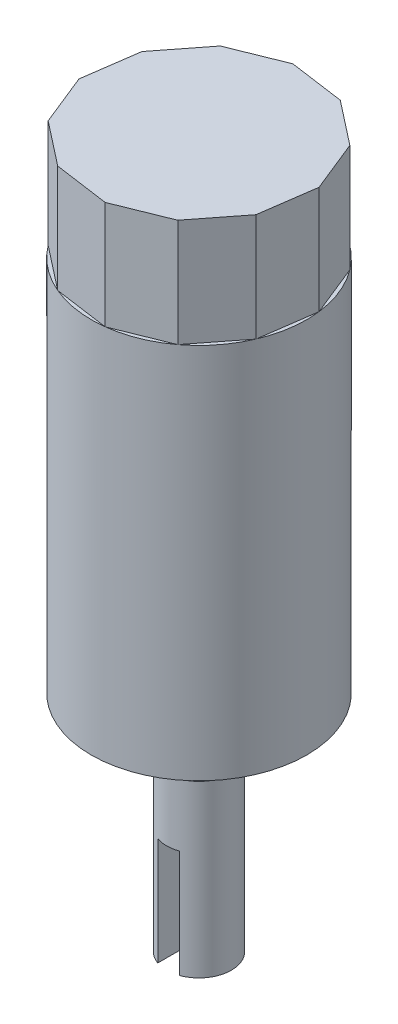
ISO-10303-21;
HEADER;
FILE_DESCRIPTION(('STEP AP214'),'2;1');
FILE_NAME('part.step','',(''),(''),'','','');
FILE_SCHEMA(('AUTOMOTIVE_DESIGN { 1 0 10303 214 1 1 1 1 }'));
ENDSEC;
DATA;
#1=APPLICATION_CONTEXT('core data for automotive mechanical design processes');
#2=APPLICATION_PROTOCOL_DEFINITION('international standard','automotive_design',2000,#1);
#3=PRODUCT_CONTEXT('',#1,'mechanical');
#4=PRODUCT('Part','Part','',(#3));
#5=PRODUCT_RELATED_PRODUCT_CATEGORY('part','',(#4));
#6=PRODUCT_DEFINITION_FORMATION('','',#4);
#7=PRODUCT_DEFINITION_CONTEXT('part definition',#1,'design');
#8=PRODUCT_DEFINITION('design','',#6,#7);
#9=PRODUCT_DEFINITION_SHAPE('','',#8);
#10=(LENGTH_UNIT() NAMED_UNIT(*) SI_UNIT(.MILLI.,.METRE.));
#11=(NAMED_UNIT(*) PLANE_ANGLE_UNIT() SI_UNIT($,.RADIAN.));
#12=(NAMED_UNIT(*) SI_UNIT($,.STERADIAN.) SOLID_ANGLE_UNIT());
#13=UNCERTAINTY_MEASURE_WITH_UNIT(LENGTH_MEASURE(1.E-05),#10,'distance_accuracy_value','');
#14=(GEOMETRIC_REPRESENTATION_CONTEXT(3) GLOBAL_UNCERTAINTY_ASSIGNED_CONTEXT((#13)) GLOBAL_UNIT_ASSIGNED_CONTEXT((#10,
#11,#12)) REPRESENTATION_CONTEXT('',''));
#15=CARTESIAN_POINT('',(0.,0.,0.));
#16=DIRECTION('',(0.,0.,1.));
#17=DIRECTION('',(1.,0.,0.));
#18=AXIS2_PLACEMENT_3D('',#15,#16,#17);
#19=CARTESIAN_POINT('',(0.,32.9,0.));
#20=DIRECTION('',(0.,-1.,0.));
#21=DIRECTION('',(0.,0.,-1.));
#22=AXIS2_PLACEMENT_3D('',#19,#20,#21);
#23=CYLINDRICAL_SURFACE('',#22,5.);
#24=CARTESIAN_POINT('',(0.,10.4,0.));
#25=DIRECTION('',(0.,1.,0.));
#26=DIRECTION('',(0.,0.,1.));
#27=AXIS2_PLACEMENT_3D('',#24,#25,#26);
#28=CIRCLE('',#27,5.);
#29=CARTESIAN_POINT('',(0.,10.4,5.));
#30=VERTEX_POINT('',#29);
#31=EDGE_CURVE('E257',#30,#30,#28,.T.);
#32=ORIENTED_EDGE('',*,*,#31,.T.);
#33=EDGE_LOOP('',(#32));
#34=FACE_BOUND('',#33,.T.);
#35=CARTESIAN_POINT('',(0.,27.9,0.));
#36=DIRECTION('',(0.,1.,0.));
#37=DIRECTION('',(0.,0.,1.));
#38=AXIS2_PLACEMENT_3D('',#35,#36,#37);
#39=CIRCLE('',#38,5.);
#40=CARTESIAN_POINT('',(3.99404714228788,27.9,-3.00792078106821));
#41=VERTEX_POINT('',#40);
#42=CARTESIAN_POINT('',(1.95498589859983,27.9,-4.60195938012015));
#43=VERTEX_POINT('',#42);
#44=EDGE_CURVE('E195',#41,#43,#39,.T.);
#45=ORIENTED_EDGE('',*,*,#44,.F.);
#46=CARTESIAN_POINT('',(0.,27.9,0.));
#47=DIRECTION('',(0.,1.,0.));
#48=DIRECTION('',(0.,0.,1.));
#49=AXIS2_PLACEMENT_3D('',#46,#47,#48);
#50=CIRCLE('',#49,5.);
#51=CARTESIAN_POINT('',(4.96290667966805,27.9,-0.60791223783227));
#52=VERTEX_POINT('',#51);
#53=EDGE_CURVE('E190',#52,#41,#50,.T.);
#54=ORIENTED_EDGE('',*,*,#53,.F.);
#55=CARTESIAN_POINT('',(0.,27.9,0.));
#56=DIRECTION('',(0.,1.,0.));
#57=DIRECTION('',(0.,0.,1.));
#58=AXIS2_PLACEMENT_3D('',#55,#56,#57);
#59=CIRCLE('',#58,5.);
#60=CARTESIAN_POINT('',(4.60195938012015,27.9,1.95498589859984));
#61=VERTEX_POINT('',#60);
#62=EDGE_CURVE('E668',#61,#52,#59,.T.);
#63=ORIENTED_EDGE('',*,*,#62,.F.);
#64=CARTESIAN_POINT('',(0.,27.9,0.));
#65=DIRECTION('',(0.,1.,0.));
#66=DIRECTION('',(0.,0.,1.));
#67=AXIS2_PLACEMENT_3D('',#64,#65,#66);
#68=CIRCLE('',#67,5.);
#69=CARTESIAN_POINT('',(3.00792078106821,27.9,3.99404714228788));
#70=VERTEX_POINT('',#69);
#71=EDGE_CURVE('E722',#70,#61,#68,.T.);
#72=ORIENTED_EDGE('',*,*,#71,.F.);
#73=CARTESIAN_POINT('',(0.,27.9,0.));
#74=DIRECTION('',(0.,1.,0.));
#75=DIRECTION('',(0.,0.,1.));
#76=AXIS2_PLACEMENT_3D('',#73,#74,#75);
#77=CIRCLE('',#76,5.);
#78=CARTESIAN_POINT('',(0.60791223783227,27.9,4.96290667966805));
#79=VERTEX_POINT('',#78);
#80=EDGE_CURVE('E680',#79,#70,#77,.T.);
#81=ORIENTED_EDGE('',*,*,#80,.F.);
#82=CARTESIAN_POINT('',(0.,27.9,0.));
#83=DIRECTION('',(0.,1.,0.));
#84=DIRECTION('',(0.,0.,1.));
#85=AXIS2_PLACEMENT_3D('',#82,#83,#84);
#86=CIRCLE('',#85,5.);
#87=CARTESIAN_POINT('',(-1.95498589859982,27.9,4.60195938012015));
#88=VERTEX_POINT('',#87);
#89=EDGE_CURVE('E703',#88,#79,#86,.T.);
#90=ORIENTED_EDGE('',*,*,#89,.F.);
#91=CARTESIAN_POINT('',(0.,27.9,0.));
#92=DIRECTION('',(0.,1.,0.));
#93=DIRECTION('',(0.,0.,1.));
#94=AXIS2_PLACEMENT_3D('',#91,#92,#93);
#95=CIRCLE('',#94,5.);
#96=CARTESIAN_POINT('',(-3.99404714228787,27.9,3.00792078106823));
#97=VERTEX_POINT('',#96);
#98=EDGE_CURVE('E654',#97,#88,#95,.T.);
#99=ORIENTED_EDGE('',*,*,#98,.F.);
#100=CARTESIAN_POINT('',(0.,27.9,0.));
#101=DIRECTION('',(0.,1.,0.));
#102=DIRECTION('',(0.,0.,1.));
#103=AXIS2_PLACEMENT_3D('',#100,#101,#102);
#104=CIRCLE('',#103,5.);
#105=CARTESIAN_POINT('',(-4.96290667966805,27.9,0.60791223783227));
#106=VERTEX_POINT('',#105);
#107=EDGE_CURVE('E231',#106,#97,#104,.T.);
#108=ORIENTED_EDGE('',*,*,#107,.F.);
#109=CARTESIAN_POINT('',(0.,27.9,0.));
#110=DIRECTION('',(0.,1.,0.));
#111=DIRECTION('',(0.,0.,1.));
#112=AXIS2_PLACEMENT_3D('',#109,#110,#111);
#113=CIRCLE('',#112,5.);
#114=CARTESIAN_POINT('',(-4.60195938012015,27.9,-1.95498589859984));
#115=VERTEX_POINT('',#114);
#116=EDGE_CURVE('E642',#115,#106,#113,.T.);
#117=ORIENTED_EDGE('',*,*,#116,.F.);
#118=CARTESIAN_POINT('',(0.,27.9,0.));
#119=DIRECTION('',(0.,1.,0.));
#120=DIRECTION('',(0.,0.,1.));
#121=AXIS2_PLACEMENT_3D('',#118,#119,#120);
#122=CIRCLE('',#121,5.);
#123=CARTESIAN_POINT('',(-3.00792078106821,27.9,-3.99404714228788));
#124=VERTEX_POINT('',#123);
#125=EDGE_CURVE('E623',#124,#115,#122,.T.);
#126=ORIENTED_EDGE('',*,*,#125,.F.);
#127=CARTESIAN_POINT('',(0.,27.9,0.));
#128=DIRECTION('',(0.,1.,0.));
#129=DIRECTION('',(0.,0.,1.));
#130=AXIS2_PLACEMENT_3D('',#127,#128,#129);
#131=CIRCLE('',#130,5.);
#132=CARTESIAN_POINT('',(-0.607912237832263,27.9,-4.96290667966805));
#133=VERTEX_POINT('',#132);
#134=EDGE_CURVE('E616',#133,#124,#131,.T.);
#135=ORIENTED_EDGE('',*,*,#134,.F.);
#136=CARTESIAN_POINT('',(0.,27.9,0.));
#137=DIRECTION('',(0.,1.,0.));
#138=DIRECTION('',(0.,0.,1.));
#139=AXIS2_PLACEMENT_3D('',#136,#137,#138);
#140=CIRCLE('',#139,5.);
#141=EDGE_CURVE('E206',#43,#133,#140,.T.);
#142=ORIENTED_EDGE('',*,*,#141,.F.);
#143=EDGE_LOOP('',(#45,#54,#63,#72,#81,#90,#99,#108,#117,#126,#135,#142));
#144=FACE_BOUND('',#143,.T.);
#145=ADVANCED_FACE('F62',(#34,#144),#23,.T.);
#146=CARTESIAN_POINT('',(0.,32.9,0.));
#147=DIRECTION('',(0.,1.,0.));
#148=DIRECTION('',(0.,0.,1.));
#149=AXIS2_PLACEMENT_3D('',#146,#147,#148);
#150=PLANE('',#149);
#151=DIRECTION('',(-0.374338579680795,0.,-0.927292094090403));
#152=VECTOR('',#151,1.);
#153=CARTESIAN_POINT('',(4.47847691097797,32.9,-1.80791650945024));
#154=LINE('',#153,#152);
#155=CARTESIAN_POINT('',(4.96290667966805,32.9,-0.60791223783227));
#156=VERTEX_POINT('',#155);
#157=CARTESIAN_POINT('',(3.99404714228788,32.9,-3.00792078106822));
#158=VERTEX_POINT('',#157);
#159=EDGE_CURVE('E217',#156,#158,#154,.T.);
#160=ORIENTED_EDGE('',*,*,#159,.T.);
#161=DIRECTION('',(-0.787832766665356,0.,-0.615889220370362));
#162=VECTOR('',#161,1.);
#163=CARTESIAN_POINT('',(2.97451652044386,32.9,-3.80494008059418));
#164=LINE('',#163,#162);
#165=CARTESIAN_POINT('',(1.95498589859983,32.9,-4.60195938012015));
#166=VERTEX_POINT('',#165);
#167=EDGE_CURVE('E183',#158,#166,#164,.T.);
#168=ORIENTED_EDGE('',*,*,#167,.T.);
#169=DIRECTION('',(-0.990227800051157,0.,-0.139459327425048));
#170=VECTOR('',#169,1.);
#171=CARTESIAN_POINT('',(0.673536830383785,32.9,-4.7824330298941));
#172=LINE('',#171,#170);
#173=CARTESIAN_POINT('',(-0.607912237832263,32.9,-4.96290667966805));
#174=VERTEX_POINT('',#173);
#175=EDGE_CURVE('E246',#166,#174,#172,.T.);
#176=ORIENTED_EDGE('',*,*,#175,.T.);
#177=DIRECTION('',(-0.927292094090403,0.,0.374338579680795));
#178=VECTOR('',#177,1.);
#179=CARTESIAN_POINT('',(-1.80791650945025,32.9,-4.47847691097797));
#180=LINE('',#179,#178);
#181=CARTESIAN_POINT('',(-3.00792078106821,32.9,-3.99404714228788));
#182=VERTEX_POINT('',#181);
#183=EDGE_CURVE('E208',#174,#182,#180,.T.);
#184=ORIENTED_EDGE('',*,*,#183,.T.);
#185=DIRECTION('',(-0.615889220370361,0.,0.787832766665356));
#186=VECTOR('',#185,1.);
#187=CARTESIAN_POINT('',(-3.80494008059418,32.9,-2.97451652044385));
#188=LINE('',#187,#186);
#189=CARTESIAN_POINT('',(-4.60195938012014,32.9,-1.95498589859984));
#190=VERTEX_POINT('',#189);
#191=EDGE_CURVE('E256',#182,#190,#188,.T.);
#192=ORIENTED_EDGE('',*,*,#191,.T.);
#193=DIRECTION('',(-0.139459327425048,0.,0.990227800051157));
#194=VECTOR('',#193,1.);
#195=CARTESIAN_POINT('',(-4.7824330298941,32.9,-0.673536830383785));
#196=LINE('',#195,#194);
#197=CARTESIAN_POINT('',(-4.96290667966805,32.9,0.60791223783227));
#198=VERTEX_POINT('',#197);
#199=EDGE_CURVE('E88',#190,#198,#196,.T.);
#200=ORIENTED_EDGE('',*,*,#199,.T.);
#201=DIRECTION('',(0.374338579680796,0.,0.927292094090403));
#202=VECTOR('',#201,1.);
#203=CARTESIAN_POINT('',(-4.47847691097796,32.9,1.80791650945025));
#204=LINE('',#203,#202);
#205=CARTESIAN_POINT('',(-3.99404714228787,32.9,3.00792078106823));
#206=VERTEX_POINT('',#205);
#207=EDGE_CURVE('E232',#198,#206,#204,.T.);
#208=ORIENTED_EDGE('',*,*,#207,.T.);
#209=DIRECTION('',(0.787832766665357,0.,0.61588922037036));
#210=VECTOR('',#209,1.);
#211=CARTESIAN_POINT('',(-2.97451652044385,32.9,3.80494008059419));
#212=LINE('',#211,#210);
#213=CARTESIAN_POINT('',(-1.95498589859982,32.9,4.60195938012015));
#214=VERTEX_POINT('',#213);
#215=EDGE_CURVE('E80',#206,#214,#212,.T.);
#216=ORIENTED_EDGE('',*,*,#215,.T.);
#217=DIRECTION('',(0.990227800051157,0.,0.139459327425044));
#218=VECTOR('',#217,1.);
#219=CARTESIAN_POINT('',(-0.673536830383771,32.9,4.7824330298941));
#220=LINE('',#219,#218);
#221=CARTESIAN_POINT('',(0.60791223783227,32.9,4.96290667966805));
#222=VERTEX_POINT('',#221);
#223=EDGE_CURVE('E704',#214,#222,#220,.T.);
#224=ORIENTED_EDGE('',*,*,#223,.T.);
#225=DIRECTION('',(0.927292094090403,0.,-0.374338579680795));
#226=VECTOR('',#225,1.);
#227=CARTESIAN_POINT('',(1.80791650945024,32.9,4.47847691097797));
#228=LINE('',#227,#226);
#229=CARTESIAN_POINT('',(3.00792078106821,32.9,3.99404714228788));
#230=VERTEX_POINT('',#229);
#231=EDGE_CURVE('E675',#222,#230,#228,.T.);
#232=ORIENTED_EDGE('',*,*,#231,.T.);
#233=DIRECTION('',(0.615889220370362,0.,-0.787832766665355));
#234=VECTOR('',#233,1.);
#235=CARTESIAN_POINT('',(3.80494008059418,32.9,2.97451652044386));
#236=LINE('',#235,#234);
#237=CARTESIAN_POINT('',(4.60195938012015,32.9,1.95498589859984));
#238=VERTEX_POINT('',#237);
#239=EDGE_CURVE('E189',#230,#238,#236,.T.);
#240=ORIENTED_EDGE('',*,*,#239,.T.);
#241=DIRECTION('',(0.139459327425048,0.,-0.990227800051157));
#242=VECTOR('',#241,1.);
#243=CARTESIAN_POINT('',(4.7824330298941,32.9,0.673536830383785));
#244=LINE('',#243,#242);
#245=EDGE_CURVE('E663',#238,#156,#244,.T.);
#246=ORIENTED_EDGE('',*,*,#245,.T.);
#247=EDGE_LOOP('',(#160,#168,#176,#184,#192,#200,#208,#216,#224,#232,#240,#246));
#248=FACE_BOUND('',#247,.T.);
#249=ADVANCED_FACE('F341',(#248),#150,.T.);
#250=CARTESIAN_POINT('',(0.,0.,0.));
#251=DIRECTION('',(0.,1.,0.));
#252=DIRECTION('',(0.,0.,1.));
#253=AXIS2_PLACEMENT_3D('',#250,#251,#252);
#254=PLANE('',#253);
#255=CARTESIAN_POINT('',(0.,0.,0.));
#256=DIRECTION('',(0.,1.,0.));
#257=DIRECTION('',(0.,0.,1.));
#258=AXIS2_PLACEMENT_3D('',#255,#256,#257);
#259=CIRCLE('',#258,1.5);
#260=CARTESIAN_POINT('',(0.5,0.,1.4142135623731));
#261=VERTEX_POINT('',#260);
#262=CARTESIAN_POINT('',(0.5,0.,-1.4142135623731));
#263=VERTEX_POINT('',#262);
#264=EDGE_CURVE('E66',#261,#263,#259,.T.);
#265=ORIENTED_EDGE('',*,*,#264,.F.);
#266=DIRECTION('',(0.,0.,1.));
#267=VECTOR('',#266,1.);
#268=CARTESIAN_POINT('',(0.5,0.,-1.4142135623731));
#269=LINE('',#268,#267);
#270=EDGE_CURVE('E272',#263,#261,#269,.T.);
#271=ORIENTED_EDGE('',*,*,#270,.F.);
#272=EDGE_LOOP('',(#265,#271));
#273=FACE_BOUND('',#272,.T.);
#274=ADVANCED_FACE('F328',(#273),#254,.F.);
#275=CARTESIAN_POINT('',(0.,7.9,0.));
#276=DIRECTION('',(0.,-1.,0.));
#277=DIRECTION('',(0.,0.,-1.));
#278=AXIS2_PLACEMENT_3D('',#275,#276,#277);
#279=CYLINDRICAL_SURFACE('',#278,1.5);
#280=ORIENTED_EDGE('',*,*,#264,.T.);
#281=DIRECTION('',(0.,-1.,0.));
#282=VECTOR('',#281,1.);
#283=CARTESIAN_POINT('',(0.5,5.,-1.4142135623731));
#284=LINE('',#283,#282);
#285=CARTESIAN_POINT('',(0.5,5.,-1.4142135623731));
#286=VERTEX_POINT('',#285);
#287=EDGE_CURVE('E293',#286,#263,#284,.T.);
#288=ORIENTED_EDGE('',*,*,#287,.F.);
#289=CARTESIAN_POINT('',(0.,5.,0.));
#290=DIRECTION('',(0.,-1.,0.));
#291=DIRECTION('',(0.,0.,-1.));
#292=AXIS2_PLACEMENT_3D('',#289,#290,#291);
#293=CIRCLE('',#292,1.5);
#294=CARTESIAN_POINT('',(-0.5,5.,-1.4142135623731));
#295=VERTEX_POINT('',#294);
#296=EDGE_CURVE('E276',#295,#286,#293,.T.);
#297=ORIENTED_EDGE('',*,*,#296,.F.);
#298=DIRECTION('',(0.,-1.,0.));
#299=VECTOR('',#298,1.);
#300=CARTESIAN_POINT('',(-0.5,5.,-1.4142135623731));
#301=LINE('',#300,#299);
#302=CARTESIAN_POINT('',(-0.5,0.,-1.4142135623731));
#303=VERTEX_POINT('',#302);
#304=EDGE_CURVE('E296',#295,#303,#301,.T.);
#305=ORIENTED_EDGE('',*,*,#304,.T.);
#306=CARTESIAN_POINT('',(-0.5,0.,1.4142135623731));
#307=VERTEX_POINT('',#306);
#308=EDGE_CURVE('E292',#303,#307,#259,.T.);
#309=ORIENTED_EDGE('',*,*,#308,.T.);
#310=DIRECTION('',(0.,-1.,0.));
#311=VECTOR('',#310,1.);
#312=CARTESIAN_POINT('',(-0.5,5.,1.4142135623731));
#313=LINE('',#312,#311);
#314=CARTESIAN_POINT('',(-0.5,5.,1.4142135623731));
#315=VERTEX_POINT('',#314);
#316=EDGE_CURVE('E283',#315,#307,#313,.T.);
#317=ORIENTED_EDGE('',*,*,#316,.F.);
#318=CARTESIAN_POINT('',(0.,5.,0.));
#319=DIRECTION('',(0.,-1.,0.));
#320=DIRECTION('',(0.,0.,1.));
#321=AXIS2_PLACEMENT_3D('',#318,#319,#320);
#322=CIRCLE('',#321,1.50000000000001);
#323=CARTESIAN_POINT('',(0.5,5.,1.4142135623731));
#324=VERTEX_POINT('',#323);
#325=EDGE_CURVE('E267',#324,#315,#322,.T.);
#326=ORIENTED_EDGE('',*,*,#325,.F.);
#327=DIRECTION('',(0.,-1.,0.));
#328=VECTOR('',#327,1.);
#329=CARTESIAN_POINT('',(0.5,5.,1.4142135623731));
#330=LINE('',#329,#328);
#331=EDGE_CURVE('E288',#324,#261,#330,.T.);
#332=ORIENTED_EDGE('',*,*,#331,.T.);
#333=EDGE_LOOP('',(#280,#288,#297,#305,#309,#317,#326,#332));
#334=FACE_BOUND('',#333,.T.);
#335=CARTESIAN_POINT('',(0.,7.9,0.));
#336=DIRECTION('',(0.,1.,0.));
#337=DIRECTION('',(0.,0.,1.));
#338=AXIS2_PLACEMENT_3D('',#335,#336,#337);
#339=CIRCLE('',#338,1.5);
#340=CARTESIAN_POINT('',(0.,7.9,1.5));
#341=VERTEX_POINT('',#340);
#342=EDGE_CURVE('E72',#341,#341,#339,.T.);
#343=ORIENTED_EDGE('',*,*,#342,.F.);
#344=EDGE_LOOP('',(#343));
#345=FACE_BOUND('',#344,.T.);
#346=ADVANCED_FACE('F64',(#334,#345),#279,.T.);
#347=CARTESIAN_POINT('',(0.,7.9,0.));
#348=DIRECTION('',(0.,1.,0.));
#349=DIRECTION('',(0.,0.,1.));
#350=AXIS2_PLACEMENT_3D('',#347,#348,#349);
#351=PLANE('',#350);
#352=CARTESIAN_POINT('',(0.,7.9,0.));
#353=DIRECTION('',(0.,1.,0.));
#354=DIRECTION('',(0.,0.,1.));
#355=AXIS2_PLACEMENT_3D('',#352,#353,#354);
#356=CIRCLE('',#355,1.);
#357=CARTESIAN_POINT('',(0.,7.9,1.));
#358=VERTEX_POINT('',#357);
#359=EDGE_CURVE('E12',#358,#358,#356,.T.);
#360=ORIENTED_EDGE('',*,*,#359,.F.);
#361=EDGE_LOOP('',(#360));
#362=FACE_BOUND('',#361,.T.);
#363=ORIENTED_EDGE('',*,*,#342,.T.);
#364=EDGE_LOOP('',(#363));
#365=FACE_BOUND('',#364,.T.);
#366=ADVANCED_FACE('F338',(#362,#365),#351,.T.);
#367=ORIENTED_EDGE('',*,*,#308,.F.);
#368=DIRECTION('',(0.,0.,-1.));
#369=VECTOR('',#368,1.);
#370=CARTESIAN_POINT('',(-0.5,0.,1.4142135623731));
#371=LINE('',#370,#369);
#372=EDGE_CURVE('E265',#307,#303,#371,.T.);
#373=ORIENTED_EDGE('',*,*,#372,.F.);
#374=EDGE_LOOP('',(#367,#373));
#375=FACE_BOUND('',#374,.T.);
#376=ADVANCED_FACE('F319',(#375),#254,.F.);
#377=CARTESIAN_POINT('',(0.5,5.,-1.4142135623731));
#378=DIRECTION('',(1.,0.,0.));
#379=DIRECTION('',(0.,0.,-1.));
#380=AXIS2_PLACEMENT_3D('',#377,#378,#379);
#381=PLANE('',#380);
#382=ORIENTED_EDGE('',*,*,#270,.T.);
#383=ORIENTED_EDGE('',*,*,#331,.F.);
#384=DIRECTION('',(0.,0.,1.));
#385=VECTOR('',#384,1.);
#386=CARTESIAN_POINT('',(0.5,5.,-1.4142135623731));
#387=LINE('',#386,#385);
#388=EDGE_CURVE('E279',#286,#324,#387,.T.);
#389=ORIENTED_EDGE('',*,*,#388,.F.);
#390=ORIENTED_EDGE('',*,*,#287,.T.);
#391=EDGE_LOOP('',(#382,#383,#389,#390));
#392=FACE_BOUND('',#391,.T.);
#393=ADVANCED_FACE('F329',(#392),#381,.F.);
#394=CARTESIAN_POINT('',(-0.5,5.,1.4142135623731));
#395=DIRECTION('',(-1.,0.,0.));
#396=DIRECTION('',(0.,0.,1.));
#397=AXIS2_PLACEMENT_3D('',#394,#395,#396);
#398=PLANE('',#397);
#399=ORIENTED_EDGE('',*,*,#372,.T.);
#400=ORIENTED_EDGE('',*,*,#304,.F.);
#401=DIRECTION('',(0.,0.,-1.));
#402=VECTOR('',#401,1.);
#403=CARTESIAN_POINT('',(-0.5,5.,1.4142135623731));
#404=LINE('',#403,#402);
#405=EDGE_CURVE('E271',#315,#295,#404,.T.);
#406=ORIENTED_EDGE('',*,*,#405,.F.);
#407=ORIENTED_EDGE('',*,*,#316,.T.);
#408=EDGE_LOOP('',(#399,#400,#406,#407));
#409=FACE_BOUND('',#408,.T.);
#410=ADVANCED_FACE('F321',(#409),#398,.F.);
#411=CARTESIAN_POINT('',(0.,5.,0.));
#412=DIRECTION('',(0.,1.,0.));
#413=DIRECTION('',(0.,0.,1.));
#414=AXIS2_PLACEMENT_3D('',#411,#412,#413);
#415=PLANE('',#414);
#416=ORIENTED_EDGE('',*,*,#325,.T.);
#417=ORIENTED_EDGE('',*,*,#405,.T.);
#418=ORIENTED_EDGE('',*,*,#296,.T.);
#419=ORIENTED_EDGE('',*,*,#388,.T.);
#420=EDGE_LOOP('',(#416,#417,#418,#419));
#421=FACE_BOUND('',#420,.T.);
#422=ADVANCED_FACE('F323',(#421),#415,.F.);
#423=CARTESIAN_POINT('',(0.,10.4,0.));
#424=DIRECTION('',(0.,-1.,0.));
#425=DIRECTION('',(0.,0.,-1.));
#426=AXIS2_PLACEMENT_3D('',#423,#424,#425);
#427=CYLINDRICAL_SURFACE('',#426,1.);
#428=CARTESIAN_POINT('',(0.,10.4,0.));
#429=DIRECTION('',(0.,1.,0.));
#430=DIRECTION('',(0.,0.,1.));
#431=AXIS2_PLACEMENT_3D('',#428,#429,#430);
#432=CIRCLE('',#431,1.);
#433=CARTESIAN_POINT('',(0.,10.4,1.));
#434=VERTEX_POINT('',#433);
#435=EDGE_CURVE('E261',#434,#434,#432,.T.);
#436=ORIENTED_EDGE('',*,*,#435,.F.);
#437=EDGE_LOOP('',(#436));
#438=FACE_BOUND('',#437,.T.);
#439=ORIENTED_EDGE('',*,*,#359,.T.);
#440=EDGE_LOOP('',(#439));
#441=FACE_BOUND('',#440,.T.);
#442=ADVANCED_FACE('F353',(#438,#441),#427,.T.);
#443=CARTESIAN_POINT('',(0.,10.4,0.));
#444=DIRECTION('',(0.,1.,0.));
#445=DIRECTION('',(0.,0.,1.));
#446=AXIS2_PLACEMENT_3D('',#443,#444,#445);
#447=PLANE('',#446);
#448=ORIENTED_EDGE('',*,*,#435,.T.);
#449=EDGE_LOOP('',(#448));
#450=FACE_BOUND('',#449,.T.);
#451=ORIENTED_EDGE('',*,*,#31,.F.);
#452=EDGE_LOOP('',(#451));
#453=FACE_BOUND('',#452,.T.);
#454=ADVANCED_FACE('F352',(#450,#453),#447,.F.);
#455=CARTESIAN_POINT('',(0.673536830383785,27.9,-4.7824330298941));
#456=DIRECTION('',(0.139459327425048,0.,-0.990227800051157));
#457=DIRECTION('',(-0.990227800051157,0.,-0.139459327425048));
#458=AXIS2_PLACEMENT_3D('',#455,#456,#457);
#459=PLANE('',#458);
#460=ORIENTED_EDGE('',*,*,#175,.F.);
#461=DIRECTION('',(0.,1.,0.));
#462=VECTOR('',#461,1.);
#463=CARTESIAN_POINT('',(1.95498589859983,27.9,-4.60195938012015));
#464=LINE('',#463,#462);
#465=EDGE_CURVE('E249',#43,#166,#464,.T.);
#466=ORIENTED_EDGE('',*,*,#465,.F.);
#467=DIRECTION('',(-0.990227800051157,0.,-0.139459327425048));
#468=VECTOR('',#467,1.);
#469=CARTESIAN_POINT('',(0.673536830383785,27.9,-4.7824330298941));
#470=LINE('',#469,#468);
#471=EDGE_CURVE('E242',#43,#133,#470,.T.);
#472=ORIENTED_EDGE('',*,*,#471,.T.);
#473=DIRECTION('',(0.,1.,0.));
#474=VECTOR('',#473,1.);
#475=CARTESIAN_POINT('',(-0.607912237832263,27.9,-4.96290667966805));
#476=LINE('',#475,#474);
#477=EDGE_CURVE('E625',#133,#174,#476,.T.);
#478=ORIENTED_EDGE('',*,*,#477,.T.);
#479=EDGE_LOOP('',(#460,#466,#472,#478));
#480=FACE_BOUND('',#479,.T.);
#481=ADVANCED_FACE('F371',(#480),#459,.T.);
#482=CARTESIAN_POINT('',(0.,27.9,0.));
#483=DIRECTION('',(0.,1.,0.));
#484=DIRECTION('',(0.,0.,1.));
#485=AXIS2_PLACEMENT_3D('',#482,#483,#484);
#486=PLANE('',#485);
#487=ORIENTED_EDGE('',*,*,#471,.F.);
#488=ORIENTED_EDGE('',*,*,#141,.T.);
#489=EDGE_LOOP('',(#487,#488));
#490=FACE_BOUND('',#489,.T.);
#491=ADVANCED_FACE('F389',(#490),#486,.T.);
#492=CARTESIAN_POINT('',(-0.673536830383771,27.9,4.7824330298941));
#493=DIRECTION('',(-0.139459327425044,0.,0.990227800051157));
#494=DIRECTION('',(0.990227800051157,0.,0.139459327425044));
#495=AXIS2_PLACEMENT_3D('',#492,#493,#494);
#496=PLANE('',#495);
#497=ORIENTED_EDGE('',*,*,#223,.F.);
#498=DIRECTION('',(0.,1.,0.));
#499=VECTOR('',#498,1.);
#500=CARTESIAN_POINT('',(-1.95498589859982,27.9,4.60195938012015));
#501=LINE('',#500,#499);
#502=EDGE_CURVE('E708',#88,#214,#501,.T.);
#503=ORIENTED_EDGE('',*,*,#502,.F.);
#504=DIRECTION('',(0.990227800051157,0.,0.139459327425044));
#505=VECTOR('',#504,1.);
#506=CARTESIAN_POINT('',(-0.673536830383771,27.9,4.7824330298941));
#507=LINE('',#506,#505);
#508=EDGE_CURVE('E699',#88,#79,#507,.T.);
#509=ORIENTED_EDGE('',*,*,#508,.T.);
#510=DIRECTION('',(0.,1.,0.));
#511=VECTOR('',#510,1.);
#512=CARTESIAN_POINT('',(0.60791223783227,27.9,4.96290667966805));
#513=LINE('',#512,#511);
#514=EDGE_CURVE('E262',#79,#222,#513,.T.);
#515=ORIENTED_EDGE('',*,*,#514,.T.);
#516=EDGE_LOOP('',(#497,#503,#509,#515));
#517=FACE_BOUND('',#516,.T.);
#518=ADVANCED_FACE('F396',(#517),#496,.T.);
#519=CARTESIAN_POINT('',(0.,27.9,0.));
#520=DIRECTION('',(0.,1.,0.));
#521=DIRECTION('',(0.,0.,1.));
#522=AXIS2_PLACEMENT_3D('',#519,#520,#521);
#523=PLANE('',#522);
#524=ORIENTED_EDGE('',*,*,#508,.F.);
#525=ORIENTED_EDGE('',*,*,#89,.T.);
#526=EDGE_LOOP('',(#524,#525));
#527=FACE_BOUND('',#526,.T.);
#528=ADVANCED_FACE('F404',(#527),#523,.T.);
#529=CARTESIAN_POINT('',(3.80494008059418,27.9,2.97451652044386));
#530=DIRECTION('',(0.787832766665355,0.,0.615889220370362));
#531=DIRECTION('',(0.615889220370362,0.,-0.787832766665355));
#532=AXIS2_PLACEMENT_3D('',#529,#530,#531);
#533=PLANE('',#532);
#534=ORIENTED_EDGE('',*,*,#239,.F.);
#535=DIRECTION('',(0.,1.,0.));
#536=VECTOR('',#535,1.);
#537=CARTESIAN_POINT('',(3.00792078106821,27.9,3.99404714228788));
#538=LINE('',#537,#536);
#539=EDGE_CURVE('E253',#70,#230,#538,.T.);
#540=ORIENTED_EDGE('',*,*,#539,.F.);
#541=DIRECTION('',(0.615889220370362,0.,-0.787832766665355));
#542=VECTOR('',#541,1.);
#543=CARTESIAN_POINT('',(3.80494008059418,27.9,2.97451652044386));
#544=LINE('',#543,#542);
#545=EDGE_CURVE('E718',#70,#61,#544,.T.);
#546=ORIENTED_EDGE('',*,*,#545,.T.);
#547=DIRECTION('',(0.,1.,0.));
#548=VECTOR('',#547,1.);
#549=CARTESIAN_POINT('',(4.60195938012015,27.9,1.95498589859984));
#550=LINE('',#549,#548);
#551=EDGE_CURVE('E712',#61,#238,#550,.T.);
#552=ORIENTED_EDGE('',*,*,#551,.T.);
#553=EDGE_LOOP('',(#534,#540,#546,#552));
#554=FACE_BOUND('',#553,.T.);
#555=ADVANCED_FACE('F412',(#554),#533,.T.);
#556=CARTESIAN_POINT('',(0.,27.9,0.));
#557=DIRECTION('',(0.,1.,0.));
#558=DIRECTION('',(0.,0.,1.));
#559=AXIS2_PLACEMENT_3D('',#556,#557,#558);
#560=PLANE('',#559);
#561=ORIENTED_EDGE('',*,*,#545,.F.);
#562=ORIENTED_EDGE('',*,*,#71,.T.);
#563=EDGE_LOOP('',(#561,#562));
#564=FACE_BOUND('',#563,.T.);
#565=ADVANCED_FACE('F420',(#564),#560,.T.);
#566=CARTESIAN_POINT('',(4.47847691097797,27.9,-1.80791650945024));
#567=DIRECTION('',(0.927292094090403,0.,-0.374338579680795));
#568=DIRECTION('',(-0.374338579680795,0.,-0.927292094090403));
#569=AXIS2_PLACEMENT_3D('',#566,#567,#568);
#570=PLANE('',#569);
#571=ORIENTED_EDGE('',*,*,#159,.F.);
#572=DIRECTION('',(0.,1.,0.));
#573=VECTOR('',#572,1.);
#574=CARTESIAN_POINT('',(4.96290667966805,27.9,-0.60791223783227));
#575=LINE('',#574,#573);
#576=EDGE_CURVE('E214',#52,#156,#575,.T.);
#577=ORIENTED_EDGE('',*,*,#576,.F.);
#578=DIRECTION('',(-0.374338579680795,0.,-0.927292094090403));
#579=VECTOR('',#578,1.);
#580=CARTESIAN_POINT('',(4.47847691097797,27.9,-1.80791650945024));
#581=LINE('',#580,#579);
#582=EDGE_CURVE('E212',#52,#41,#581,.T.);
#583=ORIENTED_EDGE('',*,*,#582,.T.);
#584=DIRECTION('',(0.,1.,0.));
#585=VECTOR('',#584,1.);
#586=CARTESIAN_POINT('',(3.99404714228788,27.9,-3.00792078106821));
#587=LINE('',#586,#585);
#588=EDGE_CURVE('E177',#41,#158,#587,.T.);
#589=ORIENTED_EDGE('',*,*,#588,.T.);
#590=EDGE_LOOP('',(#571,#577,#583,#589));
#591=FACE_BOUND('',#590,.T.);
#592=ADVANCED_FACE('F213',(#591),#570,.T.);
#593=CARTESIAN_POINT('',(0.,27.9,0.));
#594=DIRECTION('',(0.,1.,0.));
#595=DIRECTION('',(0.,0.,1.));
#596=AXIS2_PLACEMENT_3D('',#593,#594,#595);
#597=PLANE('',#596);
#598=ORIENTED_EDGE('',*,*,#582,.F.);
#599=ORIENTED_EDGE('',*,*,#53,.T.);
#600=EDGE_LOOP('',(#598,#599));
#601=FACE_BOUND('',#600,.T.);
#602=ADVANCED_FACE('F219',(#601),#597,.T.);
#603=CARTESIAN_POINT('',(-4.47847691097796,27.9,1.80791650945025));
#604=DIRECTION('',(-0.927292094090403,0.,0.374338579680796));
#605=DIRECTION('',(0.374338579680796,0.,0.927292094090403));
#606=AXIS2_PLACEMENT_3D('',#603,#604,#605);
#607=PLANE('',#606);
#608=ORIENTED_EDGE('',*,*,#207,.F.);
#609=DIRECTION('',(0.,1.,0.));
#610=VECTOR('',#609,1.);
#611=CARTESIAN_POINT('',(-4.96290667966805,27.9,0.60791223783227));
#612=LINE('',#611,#610);
#613=EDGE_CURVE('E225',#106,#198,#612,.T.);
#614=ORIENTED_EDGE('',*,*,#613,.F.);
#615=DIRECTION('',(0.374338579680796,0.,0.927292094090403));
#616=VECTOR('',#615,1.);
#617=CARTESIAN_POINT('',(-4.47847691097796,27.9,1.80791650945025));
#618=LINE('',#617,#616);
#619=EDGE_CURVE('E227',#106,#97,#618,.T.);
#620=ORIENTED_EDGE('',*,*,#619,.T.);
#621=DIRECTION('',(0.,1.,0.));
#622=VECTOR('',#621,1.);
#623=CARTESIAN_POINT('',(-3.99404714228787,27.9,3.00792078106823));
#624=LINE('',#623,#622);
#625=EDGE_CURVE('E658',#97,#206,#624,.T.);
#626=ORIENTED_EDGE('',*,*,#625,.T.);
#627=EDGE_LOOP('',(#608,#614,#620,#626));
#628=FACE_BOUND('',#627,.T.);
#629=ADVANCED_FACE('F441',(#628),#607,.T.);
#630=CARTESIAN_POINT('',(0.,27.9,0.));
#631=DIRECTION('',(0.,1.,0.));
#632=DIRECTION('',(0.,0.,1.));
#633=AXIS2_PLACEMENT_3D('',#630,#631,#632);
#634=PLANE('',#633);
#635=ORIENTED_EDGE('',*,*,#619,.F.);
#636=ORIENTED_EDGE('',*,*,#107,.T.);
#637=EDGE_LOOP('',(#635,#636));
#638=FACE_BOUND('',#637,.T.);
#639=ADVANCED_FACE('F448',(#638),#634,.T.);
#640=CARTESIAN_POINT('',(-3.80494008059418,27.9,-2.97451652044385));
#641=DIRECTION('',(-0.787832766665356,0.,-0.615889220370361));
#642=DIRECTION('',(-0.615889220370361,0.,0.787832766665356));
#643=AXIS2_PLACEMENT_3D('',#640,#641,#642);
#644=PLANE('',#643);
#645=ORIENTED_EDGE('',*,*,#191,.F.);
#646=DIRECTION('',(0.,1.,0.));
#647=VECTOR('',#646,1.);
#648=CARTESIAN_POINT('',(-3.00792078106821,27.9,-3.99404714228788));
#649=LINE('',#648,#647);
#650=EDGE_CURVE('E239',#124,#182,#649,.T.);
#651=ORIENTED_EDGE('',*,*,#650,.F.);
#652=DIRECTION('',(-0.615889220370361,0.,0.787832766665356));
#653=VECTOR('',#652,1.);
#654=CARTESIAN_POINT('',(-3.80494008059418,27.9,-2.97451652044385));
#655=LINE('',#654,#653);
#656=EDGE_CURVE('E688',#124,#115,#655,.T.);
#657=ORIENTED_EDGE('',*,*,#656,.T.);
#658=DIRECTION('',(0.,1.,0.));
#659=VECTOR('',#658,1.);
#660=CARTESIAN_POINT('',(-4.60195938012015,27.9,-1.95498589859984));
#661=LINE('',#660,#659);
#662=EDGE_CURVE('E646',#115,#190,#661,.T.);
#663=ORIENTED_EDGE('',*,*,#662,.T.);
#664=EDGE_LOOP('',(#645,#651,#657,#663));
#665=FACE_BOUND('',#664,.T.);
#666=ADVANCED_FACE('F456',(#665),#644,.T.);
#667=CARTESIAN_POINT('',(0.,27.9,0.));
#668=DIRECTION('',(0.,1.,0.));
#669=DIRECTION('',(0.,0.,1.));
#670=AXIS2_PLACEMENT_3D('',#667,#668,#669);
#671=PLANE('',#670);
#672=ORIENTED_EDGE('',*,*,#656,.F.);
#673=ORIENTED_EDGE('',*,*,#125,.T.);
#674=EDGE_LOOP('',(#672,#673));
#675=FACE_BOUND('',#674,.T.);
#676=ADVANCED_FACE('F464',(#675),#671,.T.);
#677=CARTESIAN_POINT('',(1.80791650945024,27.9,4.47847691097797));
#678=DIRECTION('',(0.374338579680795,0.,0.927292094090403));
#679=DIRECTION('',(0.927292094090403,0.,-0.374338579680795));
#680=AXIS2_PLACEMENT_3D('',#677,#678,#679);
#681=PLANE('',#680);
#682=ORIENTED_EDGE('',*,*,#231,.F.);
#683=ORIENTED_EDGE('',*,*,#514,.F.);
#684=DIRECTION('',(0.927292094090403,0.,-0.374338579680795));
#685=VECTOR('',#684,1.);
#686=CARTESIAN_POINT('',(1.80791650945024,27.9,4.47847691097797));
#687=LINE('',#686,#685);
#688=EDGE_CURVE('E676',#79,#70,#687,.T.);
#689=ORIENTED_EDGE('',*,*,#688,.T.);
#690=ORIENTED_EDGE('',*,*,#539,.T.);
#691=EDGE_LOOP('',(#682,#683,#689,#690));
#692=FACE_BOUND('',#691,.T.);
#693=ADVANCED_FACE('F472',(#692),#681,.T.);
#694=CARTESIAN_POINT('',(0.,27.9,0.));
#695=DIRECTION('',(0.,1.,0.));
#696=DIRECTION('',(0.,0.,1.));
#697=AXIS2_PLACEMENT_3D('',#694,#695,#696);
#698=PLANE('',#697);
#699=ORIENTED_EDGE('',*,*,#688,.F.);
#700=ORIENTED_EDGE('',*,*,#80,.T.);
#701=EDGE_LOOP('',(#699,#700));
#702=FACE_BOUND('',#701,.T.);
#703=ADVANCED_FACE('F480',(#702),#698,.T.);
#704=CARTESIAN_POINT('',(4.7824330298941,27.9,0.673536830383785));
#705=DIRECTION('',(0.990227800051157,0.,0.139459327425048));
#706=DIRECTION('',(0.139459327425048,0.,-0.990227800051157));
#707=AXIS2_PLACEMENT_3D('',#704,#705,#706);
#708=PLANE('',#707);
#709=ORIENTED_EDGE('',*,*,#245,.F.);
#710=ORIENTED_EDGE('',*,*,#551,.F.);
#711=DIRECTION('',(0.139459327425048,0.,-0.990227800051157));
#712=VECTOR('',#711,1.);
#713=CARTESIAN_POINT('',(4.7824330298941,27.9,0.673536830383785));
#714=LINE('',#713,#712);
#715=EDGE_CURVE('E664',#61,#52,#714,.T.);
#716=ORIENTED_EDGE('',*,*,#715,.T.);
#717=ORIENTED_EDGE('',*,*,#576,.T.);
#718=EDGE_LOOP('',(#709,#710,#716,#717));
#719=FACE_BOUND('',#718,.T.);
#720=ADVANCED_FACE('F488',(#719),#708,.T.);
#721=CARTESIAN_POINT('',(0.,27.9,0.));
#722=DIRECTION('',(0.,1.,0.));
#723=DIRECTION('',(0.,0.,1.));
#724=AXIS2_PLACEMENT_3D('',#721,#722,#723);
#725=PLANE('',#724);
#726=ORIENTED_EDGE('',*,*,#715,.F.);
#727=ORIENTED_EDGE('',*,*,#62,.T.);
#728=EDGE_LOOP('',(#726,#727));
#729=FACE_BOUND('',#728,.T.);
#730=ADVANCED_FACE('F496',(#729),#725,.T.);
#731=CARTESIAN_POINT('',(-2.97451652044385,27.9,3.80494008059419));
#732=DIRECTION('',(-0.61588922037036,0.,0.787832766665357));
#733=DIRECTION('',(0.787832766665357,0.,0.61588922037036));
#734=AXIS2_PLACEMENT_3D('',#731,#732,#733);
#735=PLANE('',#734);
#736=ORIENTED_EDGE('',*,*,#215,.F.);
#737=ORIENTED_EDGE('',*,*,#625,.F.);
#738=DIRECTION('',(0.787832766665357,0.,0.61588922037036));
#739=VECTOR('',#738,1.);
#740=CARTESIAN_POINT('',(-2.97451652044385,27.9,3.80494008059419));
#741=LINE('',#740,#739);
#742=EDGE_CURVE('E651',#97,#88,#741,.T.);
#743=ORIENTED_EDGE('',*,*,#742,.T.);
#744=ORIENTED_EDGE('',*,*,#502,.T.);
#745=EDGE_LOOP('',(#736,#737,#743,#744));
#746=FACE_BOUND('',#745,.T.);
#747=ADVANCED_FACE('F504',(#746),#735,.T.);
#748=CARTESIAN_POINT('',(0.,27.9,0.));
#749=DIRECTION('',(0.,1.,0.));
#750=DIRECTION('',(0.,0.,1.));
#751=AXIS2_PLACEMENT_3D('',#748,#749,#750);
#752=PLANE('',#751);
#753=ORIENTED_EDGE('',*,*,#742,.F.);
#754=ORIENTED_EDGE('',*,*,#98,.T.);
#755=EDGE_LOOP('',(#753,#754));
#756=FACE_BOUND('',#755,.T.);
#757=ADVANCED_FACE('F512',(#756),#752,.T.);
#758=CARTESIAN_POINT('',(-4.7824330298941,27.9,-0.673536830383785));
#759=DIRECTION('',(-0.990227800051157,0.,-0.139459327425048));
#760=DIRECTION('',(-0.139459327425048,0.,0.990227800051157));
#761=AXIS2_PLACEMENT_3D('',#758,#759,#760);
#762=PLANE('',#761);
#763=ORIENTED_EDGE('',*,*,#199,.F.);
#764=ORIENTED_EDGE('',*,*,#662,.F.);
#765=DIRECTION('',(-0.139459327425048,0.,0.990227800051157));
#766=VECTOR('',#765,1.);
#767=CARTESIAN_POINT('',(-4.7824330298941,27.9,-0.673536830383785));
#768=LINE('',#767,#766);
#769=EDGE_CURVE('E639',#115,#106,#768,.T.);
#770=ORIENTED_EDGE('',*,*,#769,.T.);
#771=ORIENTED_EDGE('',*,*,#613,.T.);
#772=EDGE_LOOP('',(#763,#764,#770,#771));
#773=FACE_BOUND('',#772,.T.);
#774=ADVANCED_FACE('F519',(#773),#762,.T.);
#775=CARTESIAN_POINT('',(0.,27.9,0.));
#776=DIRECTION('',(0.,1.,0.));
#777=DIRECTION('',(0.,0.,1.));
#778=AXIS2_PLACEMENT_3D('',#775,#776,#777);
#779=PLANE('',#778);
#780=ORIENTED_EDGE('',*,*,#769,.F.);
#781=ORIENTED_EDGE('',*,*,#116,.T.);
#782=EDGE_LOOP('',(#780,#781));
#783=FACE_BOUND('',#782,.T.);
#784=ADVANCED_FACE('F527',(#783),#779,.T.);
#785=CARTESIAN_POINT('',(-1.80791650945025,27.9,-4.47847691097797));
#786=DIRECTION('',(-0.374338579680795,0.,-0.927292094090403));
#787=DIRECTION('',(-0.927292094090403,0.,0.374338579680795));
#788=AXIS2_PLACEMENT_3D('',#785,#786,#787);
#789=PLANE('',#788);
#790=ORIENTED_EDGE('',*,*,#183,.F.);
#791=ORIENTED_EDGE('',*,*,#477,.F.);
#792=DIRECTION('',(-0.927292094090403,0.,0.374338579680795));
#793=VECTOR('',#792,1.);
#794=CARTESIAN_POINT('',(-1.80791650945025,27.9,-4.47847691097797));
#795=LINE('',#794,#793);
#796=EDGE_CURVE('E615',#133,#124,#795,.T.);
#797=ORIENTED_EDGE('',*,*,#796,.T.);
#798=ORIENTED_EDGE('',*,*,#650,.T.);
#799=EDGE_LOOP('',(#790,#791,#797,#798));
#800=FACE_BOUND('',#799,.T.);
#801=ADVANCED_FACE('F534',(#800),#789,.T.);
#802=CARTESIAN_POINT('',(0.,27.9,0.));
#803=DIRECTION('',(0.,1.,0.));
#804=DIRECTION('',(0.,0.,1.));
#805=AXIS2_PLACEMENT_3D('',#802,#803,#804);
#806=PLANE('',#805);
#807=ORIENTED_EDGE('',*,*,#796,.F.);
#808=ORIENTED_EDGE('',*,*,#134,.T.);
#809=EDGE_LOOP('',(#807,#808));
#810=FACE_BOUND('',#809,.T.);
#811=ADVANCED_FACE('F542',(#810),#806,.T.);
#812=CARTESIAN_POINT('',(2.97451652044386,27.9,-3.80494008059418));
#813=DIRECTION('',(0.615889220370362,0.,-0.787832766665355));
#814=DIRECTION('',(-0.787832766665355,0.,-0.615889220370362));
#815=AXIS2_PLACEMENT_3D('',#812,#813,#814);
#816=PLANE('',#815);
#817=ORIENTED_EDGE('',*,*,#167,.F.);
#818=ORIENTED_EDGE('',*,*,#588,.F.);
#819=DIRECTION('',(-0.787832766665356,0.,-0.615889220370362));
#820=VECTOR('',#819,1.);
#821=CARTESIAN_POINT('',(2.97451652044386,27.9,-3.80494008059418));
#822=LINE('',#821,#820);
#823=EDGE_CURVE('E180',#41,#43,#822,.T.);
#824=ORIENTED_EDGE('',*,*,#823,.T.);
#825=ORIENTED_EDGE('',*,*,#465,.T.);
#826=EDGE_LOOP('',(#817,#818,#824,#825));
#827=FACE_BOUND('',#826,.T.);
#828=ADVANCED_FACE('F179',(#827),#816,.T.);
#829=CARTESIAN_POINT('',(0.,27.9,0.));
#830=DIRECTION('',(0.,1.,0.));
#831=DIRECTION('',(0.,0.,1.));
#832=AXIS2_PLACEMENT_3D('',#829,#830,#831);
#833=PLANE('',#832);
#834=ORIENTED_EDGE('',*,*,#823,.F.);
#835=ORIENTED_EDGE('',*,*,#44,.T.);
#836=EDGE_LOOP('',(#834,#835));
#837=FACE_BOUND('',#836,.T.);
#838=ADVANCED_FACE('F194',(#837),#833,.T.);
#839=CLOSED_SHELL('',(#145,#249,#274,#346,#366,#376,#393,#410,#422,#442,#454,#481,#491,#518,
#528,#555,#565,#592,#602,#629,#639,#666,#676,#693,#703,#720,#730,#747,#757,#774,#784,#801,#811,
#828,#838));
#840=MANIFOLD_SOLID_BREP('B2',#839);
#841=ADVANCED_BREP_SHAPE_REPRESENTATION('',(#18,#840),#14);
#842=SHAPE_DEFINITION_REPRESENTATION(#9,#841);
ENDSEC;
END-ISO-10303-21;
